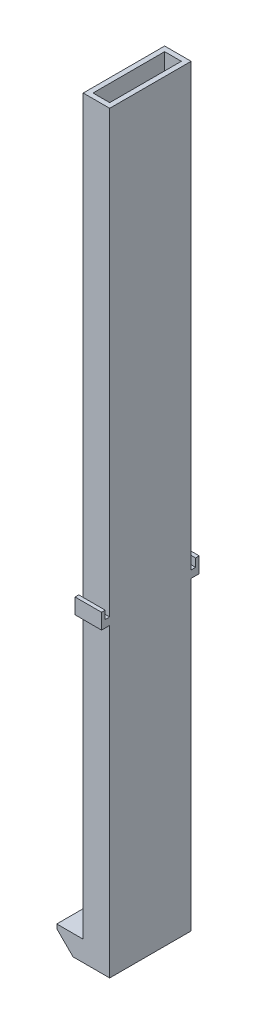
ISO-10303-21;
HEADER;
FILE_DESCRIPTION(('STEP AP214'),'2;1');
FILE_NAME('part.step','',(''),(''),'','','');
FILE_SCHEMA(('AUTOMOTIVE_DESIGN { 1 0 10303 214 1 1 1 1 }'));
ENDSEC;
DATA;
#1=APPLICATION_CONTEXT('core data for automotive mechanical design processes');
#2=APPLICATION_PROTOCOL_DEFINITION('international standard','automotive_design',2000,#1);
#3=PRODUCT_CONTEXT('',#1,'mechanical');
#4=PRODUCT('Part','Part','',(#3));
#5=PRODUCT_RELATED_PRODUCT_CATEGORY('part','',(#4));
#6=PRODUCT_DEFINITION_FORMATION('','',#4);
#7=PRODUCT_DEFINITION_CONTEXT('part definition',#1,'design');
#8=PRODUCT_DEFINITION('design','',#6,#7);
#9=PRODUCT_DEFINITION_SHAPE('','',#8);
#10=(LENGTH_UNIT() NAMED_UNIT(*) SI_UNIT(.MILLI.,.METRE.));
#11=(NAMED_UNIT(*) PLANE_ANGLE_UNIT() SI_UNIT($,.RADIAN.));
#12=(NAMED_UNIT(*) SI_UNIT($,.STERADIAN.) SOLID_ANGLE_UNIT());
#13=UNCERTAINTY_MEASURE_WITH_UNIT(LENGTH_MEASURE(1.E-05),#10,'distance_accuracy_value','');
#14=(GEOMETRIC_REPRESENTATION_CONTEXT(3) GLOBAL_UNCERTAINTY_ASSIGNED_CONTEXT((#13)) GLOBAL_UNIT_ASSIGNED_CONTEXT((#10,
#11,#12)) REPRESENTATION_CONTEXT('',''));
#15=CARTESIAN_POINT('',(0.,0.,0.));
#16=DIRECTION('',(0.,0.,1.));
#17=DIRECTION('',(1.,0.,0.));
#18=AXIS2_PLACEMENT_3D('',#15,#16,#17);
#19=CARTESIAN_POINT('',(0.,0.,0.));
#20=DIRECTION('',(0.,0.,-1.));
#21=DIRECTION('',(-1.,0.,0.));
#22=AXIS2_PLACEMENT_3D('',#19,#20,#21);
#23=PLANE('',#22);
#24=DIRECTION('',(0.,1.,0.));
#25=VECTOR('',#24,1.);
#26=CARTESIAN_POINT('',(3.25,-46.25,0.));
#27=LINE('',#26,#25);
#28=CARTESIAN_POINT('',(3.25,-7.85000000000001,0.));
#29=VERTEX_POINT('',#28);
#30=CARTESIAN_POINT('',(3.25,46.25,0.));
#31=VERTEX_POINT('',#30);
#32=EDGE_CURVE('E418',#29,#31,#27,.T.);
#33=ORIENTED_EDGE('',*,*,#32,.F.);
#34=DIRECTION('',(-1.,0.,0.));
#35=VECTOR('',#34,1.);
#36=CARTESIAN_POINT('',(3.25,-7.85000000000001,0.));
#37=LINE('',#36,#35);
#38=CARTESIAN_POINT('',(0.,-7.85,0.));
#39=VERTEX_POINT('',#38);
#40=EDGE_CURVE('E304',#29,#39,#37,.T.);
#41=ORIENTED_EDGE('',*,*,#40,.T.);
#42=DIRECTION('',(0.,1.,0.));
#43=VECTOR('',#42,1.);
#44=CARTESIAN_POINT('',(0.,46.25,0.));
#45=LINE('',#44,#43);
#46=CARTESIAN_POINT('',(0.,46.25,0.));
#47=VERTEX_POINT('',#46);
#48=EDGE_CURVE('E370',#39,#47,#45,.T.);
#49=ORIENTED_EDGE('',*,*,#48,.T.);
#50=DIRECTION('',(1.,0.,0.));
#51=VECTOR('',#50,1.);
#52=CARTESIAN_POINT('',(-3.25,46.25,0.));
#53=LINE('',#52,#51);
#54=EDGE_CURVE('E414',#47,#31,#53,.T.);
#55=ORIENTED_EDGE('',*,*,#54,.T.);
#56=EDGE_LOOP('',(#33,#41,#49,#55));
#57=FACE_BOUND('',#56,.T.);
#58=ADVANCED_FACE('F47',(#57),#23,.T.);
#59=CARTESIAN_POINT('',(0.,0.,10.));
#60=DIRECTION('',(0.,0.,-1.));
#61=DIRECTION('',(-1.,0.,0.));
#62=AXIS2_PLACEMENT_3D('',#59,#60,#61);
#63=PLANE('',#62);
#64=DIRECTION('',(-1.,0.,0.));
#65=VECTOR('',#64,1.);
#66=CARTESIAN_POINT('',(3.25,-7.85000000000001,10.));
#67=LINE('',#66,#65);
#68=CARTESIAN_POINT('',(3.25,-7.85000000000001,10.));
#69=VERTEX_POINT('',#68);
#70=CARTESIAN_POINT('',(0.,-7.85000000000001,10.));
#71=VERTEX_POINT('',#70);
#72=EDGE_CURVE('E351',#69,#71,#67,.T.);
#73=ORIENTED_EDGE('',*,*,#72,.F.);
#74=DIRECTION('',(0.,1.,0.));
#75=VECTOR('',#74,1.);
#76=CARTESIAN_POINT('',(3.25,-46.25,10.));
#77=LINE('',#76,#75);
#78=CARTESIAN_POINT('',(3.25,46.25,10.));
#79=VERTEX_POINT('',#78);
#80=EDGE_CURVE('E403',#69,#79,#77,.T.);
#81=ORIENTED_EDGE('',*,*,#80,.T.);
#82=DIRECTION('',(1.,0.,0.));
#83=VECTOR('',#82,1.);
#84=CARTESIAN_POINT('',(-3.25,46.25,10.));
#85=LINE('',#84,#83);
#86=CARTESIAN_POINT('',(0.,46.25,10.));
#87=VERTEX_POINT('',#86);
#88=EDGE_CURVE('E398',#87,#79,#85,.T.);
#89=ORIENTED_EDGE('',*,*,#88,.F.);
#90=DIRECTION('',(0.,1.,0.));
#91=VECTOR('',#90,1.);
#92=CARTESIAN_POINT('',(0.,46.25,10.));
#93=LINE('',#92,#91);
#94=EDGE_CURVE('E380',#71,#87,#93,.T.);
#95=ORIENTED_EDGE('',*,*,#94,.F.);
#96=EDGE_LOOP('',(#73,#81,#89,#95));
#97=FACE_BOUND('',#96,.T.);
#98=ADVANCED_FACE('F486',(#97),#63,.F.);
#99=CARTESIAN_POINT('',(-3.25,-46.25,10.));
#100=DIRECTION('',(-1.,0.,0.));
#101=DIRECTION('',(0.,0.,1.));
#102=AXIS2_PLACEMENT_3D('',#99,#100,#101);
#103=PLANE('',#102);
#104=DIRECTION('',(0.,1.,0.));
#105=VECTOR('',#104,1.);
#106=CARTESIAN_POINT('',(-3.25,-46.25,0.));
#107=LINE('',#106,#105);
#108=CARTESIAN_POINT('',(-3.25,-44.25,0.));
#109=VERTEX_POINT('',#108);
#110=CARTESIAN_POINT('',(-3.24999999999999,-43.75,0.));
#111=VERTEX_POINT('',#110);
#112=EDGE_CURVE('E388',#109,#111,#107,.T.);
#113=ORIENTED_EDGE('',*,*,#112,.F.);
#114=DIRECTION('',(0.,0.,1.));
#115=VECTOR('',#114,1.);
#116=CARTESIAN_POINT('',(-3.25,-44.25,10.));
#117=LINE('',#116,#115);
#118=CARTESIAN_POINT('',(-3.25,-44.25,10.));
#119=VERTEX_POINT('',#118);
#120=EDGE_CURVE('E57',#109,#119,#117,.T.);
#121=ORIENTED_EDGE('',*,*,#120,.T.);
#122=DIRECTION('',(0.,1.,0.));
#123=VECTOR('',#122,1.);
#124=CARTESIAN_POINT('',(-3.25,-46.25,10.));
#125=LINE('',#124,#123);
#126=CARTESIAN_POINT('',(-3.24999999999999,-43.75,10.));
#127=VERTEX_POINT('',#126);
#128=EDGE_CURVE('E395',#119,#127,#125,.T.);
#129=ORIENTED_EDGE('',*,*,#128,.T.);
#130=DIRECTION('',(0.,0.,1.));
#131=VECTOR('',#130,1.);
#132=CARTESIAN_POINT('',(-3.24999999999999,-43.75,0.));
#133=LINE('',#132,#131);
#134=EDGE_CURVE('E376',#111,#127,#133,.T.);
#135=ORIENTED_EDGE('',*,*,#134,.F.);
#136=EDGE_LOOP('',(#113,#121,#129,#135));
#137=FACE_BOUND('',#136,.T.);
#138=ADVANCED_FACE('F443',(#137),#103,.T.);
#139=CARTESIAN_POINT('',(-3.25,-46.25,10.));
#140=DIRECTION('',(0.,1.,0.));
#141=DIRECTION('',(0.,0.,1.));
#142=AXIS2_PLACEMENT_3D('',#139,#140,#141);
#143=PLANE('',#142);
#144=DIRECTION('',(1.,0.,0.));
#145=VECTOR('',#144,1.);
#146=CARTESIAN_POINT('',(-3.25,-46.25,10.));
#147=LINE('',#146,#145);
#148=CARTESIAN_POINT('',(-1.25,-46.25,10.));
#149=VERTEX_POINT('',#148);
#150=CARTESIAN_POINT('',(3.25,-46.25,10.));
#151=VERTEX_POINT('',#150);
#152=EDGE_CURVE('E408',#149,#151,#147,.T.);
#153=ORIENTED_EDGE('',*,*,#152,.F.);
#154=DIRECTION('',(0.,0.,-1.));
#155=VECTOR('',#154,1.);
#156=CARTESIAN_POINT('',(-1.25,-46.25,0.));
#157=LINE('',#156,#155);
#158=CARTESIAN_POINT('',(-1.25,-46.25,0.));
#159=VERTEX_POINT('',#158);
#160=EDGE_CURVE('E429',#149,#159,#157,.T.);
#161=ORIENTED_EDGE('',*,*,#160,.T.);
#162=DIRECTION('',(1.,0.,0.));
#163=VECTOR('',#162,1.);
#164=CARTESIAN_POINT('',(-3.25,-46.25,0.));
#165=LINE('',#164,#163);
#166=CARTESIAN_POINT('',(3.25,-46.25,0.));
#167=VERTEX_POINT('',#166);
#168=EDGE_CURVE('E399',#159,#167,#165,.T.);
#169=ORIENTED_EDGE('',*,*,#168,.T.);
#170=DIRECTION('',(0.,0.,-1.));
#171=VECTOR('',#170,1.);
#172=CARTESIAN_POINT('',(3.25,-46.25,10.));
#173=LINE('',#172,#171);
#174=EDGE_CURVE('E425',#151,#167,#173,.T.);
#175=ORIENTED_EDGE('',*,*,#174,.F.);
#176=EDGE_LOOP('',(#153,#161,#169,#175));
#177=FACE_BOUND('',#176,.T.);
#178=ADVANCED_FACE('F455',(#177),#143,.F.);
#179=CARTESIAN_POINT('',(3.25,-46.25,10.));
#180=DIRECTION('',(-1.,0.,0.));
#181=DIRECTION('',(0.,0.,1.));
#182=AXIS2_PLACEMENT_3D('',#179,#180,#181);
#183=PLANE('',#182);
#184=CARTESIAN_POINT('',(3.25,-8.75000000000001,0.));
#185=VERTEX_POINT('',#184);
#186=EDGE_CURVE('E419',#167,#185,#27,.T.);
#187=ORIENTED_EDGE('',*,*,#186,.T.);
#188=DIRECTION('',(0.,0.,-1.));
#189=VECTOR('',#188,1.);
#190=CARTESIAN_POINT('',(3.25,-8.75000000000001,0.));
#191=LINE('',#190,#189);
#192=CARTESIAN_POINT('',(3.25,-8.75000000000001,-1.00000000000001));
#193=VERTEX_POINT('',#192);
#194=EDGE_CURVE('E254',#185,#193,#191,.T.);
#195=ORIENTED_EDGE('',*,*,#194,.T.);
#196=DIRECTION('',(0.,1.,0.));
#197=VECTOR('',#196,1.);
#198=CARTESIAN_POINT('',(3.25,-8.75000000000001,-1.00000000000001));
#199=LINE('',#198,#197);
#200=CARTESIAN_POINT('',(3.25,-6.85000000000001,-1.00000000000001));
#201=VERTEX_POINT('',#200);
#202=EDGE_CURVE('E270',#193,#201,#199,.T.);
#203=ORIENTED_EDGE('',*,*,#202,.T.);
#204=DIRECTION('',(0.,0.,1.));
#205=VECTOR('',#204,1.);
#206=CARTESIAN_POINT('',(3.25,-6.85000000000001,-1.00000000000001));
#207=LINE('',#206,#205);
#208=CARTESIAN_POINT('',(3.25,-6.85000000000001,-0.550000000000005));
#209=VERTEX_POINT('',#208);
#210=EDGE_CURVE('E267',#201,#209,#207,.T.);
#211=ORIENTED_EDGE('',*,*,#210,.T.);
#212=DIRECTION('',(0.,1.,0.));
#213=VECTOR('',#212,1.);
#214=CARTESIAN_POINT('',(3.25,-7.85000000000001,-0.550000000000005));
#215=LINE('',#214,#213);
#216=CARTESIAN_POINT('',(3.25,-7.85000000000001,-0.550000000000005));
#217=VERTEX_POINT('',#216);
#218=EDGE_CURVE('E263',#217,#209,#215,.T.);
#219=ORIENTED_EDGE('',*,*,#218,.F.);
#220=DIRECTION('',(0.,0.,-1.));
#221=VECTOR('',#220,1.);
#222=CARTESIAN_POINT('',(3.25,-7.85000000000001,0.));
#223=LINE('',#222,#221);
#224=EDGE_CURVE('E258',#29,#217,#223,.T.);
#225=ORIENTED_EDGE('',*,*,#224,.F.);
#226=ORIENTED_EDGE('',*,*,#32,.T.);
#227=DIRECTION('',(0.,0.,-1.));
#228=VECTOR('',#227,1.);
#229=CARTESIAN_POINT('',(3.25,46.25,10.));
#230=LINE('',#229,#228);
#231=EDGE_CURVE('E411',#79,#31,#230,.T.);
#232=ORIENTED_EDGE('',*,*,#231,.F.);
#233=ORIENTED_EDGE('',*,*,#80,.F.);
#234=DIRECTION('',(0.,0.,1.));
#235=VECTOR('',#234,1.);
#236=CARTESIAN_POINT('',(3.25,-7.85000000000001,10.));
#237=LINE('',#236,#235);
#238=CARTESIAN_POINT('',(3.25,-7.85000000000001,10.55));
#239=VERTEX_POINT('',#238);
#240=EDGE_CURVE('E325',#69,#239,#237,.T.);
#241=ORIENTED_EDGE('',*,*,#240,.T.);
#242=DIRECTION('',(0.,1.,0.));
#243=VECTOR('',#242,1.);
#244=CARTESIAN_POINT('',(3.25,-7.85000000000001,10.55));
#245=LINE('',#244,#243);
#246=CARTESIAN_POINT('',(3.25,-6.85000000000001,10.55));
#247=VERTEX_POINT('',#246);
#248=EDGE_CURVE('E322',#239,#247,#245,.T.);
#249=ORIENTED_EDGE('',*,*,#248,.T.);
#250=DIRECTION('',(0.,0.,-1.));
#251=VECTOR('',#250,1.);
#252=CARTESIAN_POINT('',(3.25,-6.85000000000001,11.));
#253=LINE('',#252,#251);
#254=CARTESIAN_POINT('',(3.25,-6.85000000000001,11.));
#255=VERTEX_POINT('',#254);
#256=EDGE_CURVE('E318',#255,#247,#253,.T.);
#257=ORIENTED_EDGE('',*,*,#256,.F.);
#258=DIRECTION('',(0.,1.,0.));
#259=VECTOR('',#258,1.);
#260=CARTESIAN_POINT('',(3.25,-8.75000000000001,11.));
#261=LINE('',#260,#259);
#262=CARTESIAN_POINT('',(3.25,-8.75000000000001,11.));
#263=VERTEX_POINT('',#262);
#264=EDGE_CURVE('E313',#263,#255,#261,.T.);
#265=ORIENTED_EDGE('',*,*,#264,.F.);
#266=DIRECTION('',(0.,0.,1.));
#267=VECTOR('',#266,1.);
#268=CARTESIAN_POINT('',(3.25,-8.75000000000001,10.));
#269=LINE('',#268,#267);
#270=CARTESIAN_POINT('',(3.25,-8.75000000000001,10.));
#271=VERTEX_POINT('',#270);
#272=EDGE_CURVE('E309',#271,#263,#269,.T.);
#273=ORIENTED_EDGE('',*,*,#272,.F.);
#274=EDGE_CURVE('E404',#151,#271,#77,.T.);
#275=ORIENTED_EDGE('',*,*,#274,.F.);
#276=ORIENTED_EDGE('',*,*,#174,.T.);
#277=EDGE_LOOP('',(#187,#195,#203,#211,#219,#225,#226,#232,#233,#241,#249,#257,#265,#273,#275,#276));
#278=FACE_BOUND('',#277,.T.);
#279=ADVANCED_FACE('F462',(#278),#183,.F.);
#280=CARTESIAN_POINT('',(-3.25,46.25,10.));
#281=DIRECTION('',(0.,1.,0.));
#282=DIRECTION('',(0.,0.,1.));
#283=AXIS2_PLACEMENT_3D('',#280,#281,#282);
#284=PLANE('',#283);
#285=DIRECTION('',(0.,0.,-1.));
#286=VECTOR('',#285,1.);
#287=CARTESIAN_POINT('',(2.65,46.25,9.4));
#288=LINE('',#287,#286);
#289=CARTESIAN_POINT('',(2.65,46.25,9.4));
#290=VERTEX_POINT('',#289);
#291=CARTESIAN_POINT('',(2.65,46.25,0.6));
#292=VERTEX_POINT('',#291);
#293=EDGE_CURVE('E64',#290,#292,#288,.T.);
#294=ORIENTED_EDGE('',*,*,#293,.F.);
#295=DIRECTION('',(1.,0.,0.));
#296=VECTOR('',#295,1.);
#297=CARTESIAN_POINT('',(0.6,46.25,9.4));
#298=LINE('',#297,#296);
#299=CARTESIAN_POINT('',(0.6,46.25,9.4));
#300=VERTEX_POINT('',#299);
#301=EDGE_CURVE('E226',#300,#290,#298,.T.);
#302=ORIENTED_EDGE('',*,*,#301,.F.);
#303=DIRECTION('',(0.,0.,1.));
#304=VECTOR('',#303,1.);
#305=CARTESIAN_POINT('',(0.6,46.25,9.4));
#306=LINE('',#305,#304);
#307=CARTESIAN_POINT('',(0.6,46.25,0.6));
#308=VERTEX_POINT('',#307);
#309=EDGE_CURVE('E230',#308,#300,#306,.T.);
#310=ORIENTED_EDGE('',*,*,#309,.F.);
#311=DIRECTION('',(-1.,0.,0.));
#312=VECTOR('',#311,1.);
#313=CARTESIAN_POINT('',(0.6,46.25,0.6));
#314=LINE('',#313,#312);
#315=EDGE_CURVE('E239',#292,#308,#314,.T.);
#316=ORIENTED_EDGE('',*,*,#315,.F.);
#317=EDGE_LOOP('',(#294,#302,#310,#316));
#318=FACE_BOUND('',#317,.T.);
#319=DIRECTION('',(0.,0.,1.));
#320=VECTOR('',#319,1.);
#321=CARTESIAN_POINT('',(0.,46.25,0.));
#322=LINE('',#321,#320);
#323=EDGE_CURVE('E384',#47,#87,#322,.T.);
#324=ORIENTED_EDGE('',*,*,#323,.T.);
#325=ORIENTED_EDGE('',*,*,#88,.T.);
#326=ORIENTED_EDGE('',*,*,#231,.T.);
#327=ORIENTED_EDGE('',*,*,#54,.F.);
#328=EDGE_LOOP('',(#324,#325,#326,#327));
#329=FACE_BOUND('',#328,.T.);
#330=ADVANCED_FACE('F501',(#318,#329),#284,.T.);
#331=ORIENTED_EDGE('',*,*,#274,.T.);
#332=DIRECTION('',(-1.,0.,0.));
#333=VECTOR('',#332,1.);
#334=CARTESIAN_POINT('',(3.25,-8.75000000000001,10.));
#335=LINE('',#334,#333);
#336=CARTESIAN_POINT('',(0.,-8.74999999999999,10.));
#337=VERTEX_POINT('',#336);
#338=EDGE_CURVE('E346',#271,#337,#335,.T.);
#339=ORIENTED_EDGE('',*,*,#338,.T.);
#340=CARTESIAN_POINT('',(0.,-43.75,10.));
#341=VERTEX_POINT('',#340);
#342=EDGE_CURVE('E371',#341,#337,#93,.T.);
#343=ORIENTED_EDGE('',*,*,#342,.F.);
#344=DIRECTION('',(1.,0.,0.));
#345=VECTOR('',#344,1.);
#346=CARTESIAN_POINT('',(-3.24999999999999,-43.75,10.));
#347=LINE('',#346,#345);
#348=EDGE_CURVE('E350',#127,#341,#347,.T.);
#349=ORIENTED_EDGE('',*,*,#348,.F.);
#350=ORIENTED_EDGE('',*,*,#128,.F.);
#351=DIRECTION('',(0.707106781186548,-0.707106781186548,0.));
#352=VECTOR('',#351,1.);
#353=CARTESIAN_POINT('',(-1.25,-46.25,10.));
#354=LINE('',#353,#352);
#355=EDGE_CURVE('E11',#119,#149,#354,.T.);
#356=ORIENTED_EDGE('',*,*,#355,.T.);
#357=ORIENTED_EDGE('',*,*,#152,.T.);
#358=EDGE_LOOP('',(#331,#339,#343,#349,#350,#356,#357));
#359=FACE_BOUND('',#358,.T.);
#360=ADVANCED_FACE('F449',(#359),#63,.F.);
#361=DIRECTION('',(-1.,0.,0.));
#362=VECTOR('',#361,1.);
#363=CARTESIAN_POINT('',(3.25,-8.75000000000001,0.));
#364=LINE('',#363,#362);
#365=CARTESIAN_POINT('',(0.,-8.75000000000001,0.));
#366=VERTEX_POINT('',#365);
#367=EDGE_CURVE('E273',#185,#366,#364,.T.);
#368=ORIENTED_EDGE('',*,*,#367,.F.);
#369=ORIENTED_EDGE('',*,*,#186,.F.);
#370=ORIENTED_EDGE('',*,*,#168,.F.);
#371=DIRECTION('',(-0.707106781186548,0.707106781186548,0.));
#372=VECTOR('',#371,1.);
#373=CARTESIAN_POINT('',(-23.75,-23.75,0.));
#374=LINE('',#373,#372);
#375=EDGE_CURVE('E436',#159,#109,#374,.T.);
#376=ORIENTED_EDGE('',*,*,#375,.T.);
#377=ORIENTED_EDGE('',*,*,#112,.T.);
#378=DIRECTION('',(1.,0.,0.));
#379=VECTOR('',#378,1.);
#380=CARTESIAN_POINT('',(-3.24999999999999,-43.75,0.));
#381=LINE('',#380,#379);
#382=CARTESIAN_POINT('',(0.,-43.75,0.));
#383=VERTEX_POINT('',#382);
#384=EDGE_CURVE('E366',#111,#383,#381,.T.);
#385=ORIENTED_EDGE('',*,*,#384,.T.);
#386=EDGE_CURVE('E372',#383,#366,#45,.T.);
#387=ORIENTED_EDGE('',*,*,#386,.T.);
#388=EDGE_LOOP('',(#368,#369,#370,#376,#377,#385,#387));
#389=FACE_BOUND('',#388,.T.);
#390=ADVANCED_FACE('F460',(#389),#23,.T.);
#391=CARTESIAN_POINT('',(0.,46.25,0.));
#392=DIRECTION('',(1.,0.,0.));
#393=DIRECTION('',(0.,1.,0.));
#394=AXIS2_PLACEMENT_3D('',#391,#392,#393);
#395=PLANE('',#394);
#396=ORIENTED_EDGE('',*,*,#342,.T.);
#397=DIRECTION('',(0.,0.,1.));
#398=VECTOR('',#397,1.);
#399=CARTESIAN_POINT('',(0.,-8.75000000000001,10.));
#400=LINE('',#399,#398);
#401=CARTESIAN_POINT('',(0.,-8.75000000000001,11.));
#402=VERTEX_POINT('',#401);
#403=EDGE_CURVE('E293',#337,#402,#400,.T.);
#404=ORIENTED_EDGE('',*,*,#403,.T.);
#405=DIRECTION('',(0.,1.,0.));
#406=VECTOR('',#405,1.);
#407=CARTESIAN_POINT('',(0.,-8.75000000000001,11.));
#408=LINE('',#407,#406);
#409=CARTESIAN_POINT('',(0.,-6.85000000000001,11.));
#410=VERTEX_POINT('',#409);
#411=EDGE_CURVE('E332',#402,#410,#408,.T.);
#412=ORIENTED_EDGE('',*,*,#411,.T.);
#413=DIRECTION('',(0.,0.,-1.));
#414=VECTOR('',#413,1.);
#415=CARTESIAN_POINT('',(0.,-6.85000000000001,11.));
#416=LINE('',#415,#414);
#417=CARTESIAN_POINT('',(0.,-6.85000000000001,10.55));
#418=VERTEX_POINT('',#417);
#419=EDGE_CURVE('E336',#410,#418,#416,.T.);
#420=ORIENTED_EDGE('',*,*,#419,.T.);
#421=DIRECTION('',(0.,1.,0.));
#422=VECTOR('',#421,1.);
#423=CARTESIAN_POINT('',(0.,-7.85000000000001,10.55));
#424=LINE('',#423,#422);
#425=CARTESIAN_POINT('',(0.,-7.85000000000001,10.55));
#426=VERTEX_POINT('',#425);
#427=EDGE_CURVE('E340',#426,#418,#424,.T.);
#428=ORIENTED_EDGE('',*,*,#427,.F.);
#429=DIRECTION('',(0.,0.,1.));
#430=VECTOR('',#429,1.);
#431=CARTESIAN_POINT('',(0.,-7.85000000000001,10.));
#432=LINE('',#431,#430);
#433=EDGE_CURVE('E314',#71,#426,#432,.T.);
#434=ORIENTED_EDGE('',*,*,#433,.F.);
#435=ORIENTED_EDGE('',*,*,#94,.T.);
#436=ORIENTED_EDGE('',*,*,#323,.F.);
#437=ORIENTED_EDGE('',*,*,#48,.F.);
#438=DIRECTION('',(0.,0.,-1.));
#439=VECTOR('',#438,1.);
#440=CARTESIAN_POINT('',(0.,-7.85000000000001,0.));
#441=LINE('',#440,#439);
#442=CARTESIAN_POINT('',(0.,-7.85000000000001,-0.550000000000005));
#443=VERTEX_POINT('',#442);
#444=EDGE_CURVE('E72',#39,#443,#441,.T.);
#445=ORIENTED_EDGE('',*,*,#444,.T.);
#446=DIRECTION('',(0.,1.,0.));
#447=VECTOR('',#446,1.);
#448=CARTESIAN_POINT('',(0.,-7.85000000000001,-0.550000000000005));
#449=LINE('',#448,#447);
#450=CARTESIAN_POINT('',(0.,-6.85000000000001,-0.550000000000005));
#451=VERTEX_POINT('',#450);
#452=EDGE_CURVE('E279',#443,#451,#449,.T.);
#453=ORIENTED_EDGE('',*,*,#452,.T.);
#454=DIRECTION('',(0.,0.,1.));
#455=VECTOR('',#454,1.);
#456=CARTESIAN_POINT('',(0.,-6.85000000000001,-1.00000000000001));
#457=LINE('',#456,#455);
#458=CARTESIAN_POINT('',(0.,-6.85000000000001,-1.00000000000001));
#459=VERTEX_POINT('',#458);
#460=EDGE_CURVE('E283',#459,#451,#457,.T.);
#461=ORIENTED_EDGE('',*,*,#460,.F.);
#462=DIRECTION('',(0.,1.,0.));
#463=VECTOR('',#462,1.);
#464=CARTESIAN_POINT('',(0.,-8.75000000000001,-1.00000000000001));
#465=LINE('',#464,#463);
#466=CARTESIAN_POINT('',(0.,-8.75000000000001,-1.00000000000001));
#467=VERTEX_POINT('',#466);
#468=EDGE_CURVE('E259',#467,#459,#465,.T.);
#469=ORIENTED_EDGE('',*,*,#468,.F.);
#470=DIRECTION('',(0.,0.,-1.));
#471=VECTOR('',#470,1.);
#472=CARTESIAN_POINT('',(0.,-8.75000000000001,0.));
#473=LINE('',#472,#471);
#474=EDGE_CURVE('E248',#366,#467,#473,.T.);
#475=ORIENTED_EDGE('',*,*,#474,.F.);
#476=ORIENTED_EDGE('',*,*,#386,.F.);
#477=DIRECTION('',(0.,0.,1.));
#478=VECTOR('',#477,1.);
#479=CARTESIAN_POINT('',(0.,-43.75,0.));
#480=LINE('',#479,#478);
#481=EDGE_CURVE('E389',#383,#341,#480,.T.);
#482=ORIENTED_EDGE('',*,*,#481,.T.);
#483=EDGE_LOOP('',(#396,#404,#412,#420,#428,#434,#435,#436,#437,#445,#453,#461,#469,#475,#476,#482));
#484=FACE_BOUND('',#483,.T.);
#485=ADVANCED_FACE('F469',(#484),#395,.F.);
#486=CARTESIAN_POINT('',(-3.24999999999999,-43.75,0.));
#487=DIRECTION('',(0.,-1.,0.));
#488=DIRECTION('',(0.,0.,-1.));
#489=AXIS2_PLACEMENT_3D('',#486,#487,#488);
#490=PLANE('',#489);
#491=ORIENTED_EDGE('',*,*,#348,.T.);
#492=ORIENTED_EDGE('',*,*,#481,.F.);
#493=ORIENTED_EDGE('',*,*,#384,.F.);
#494=ORIENTED_EDGE('',*,*,#134,.T.);
#495=EDGE_LOOP('',(#491,#492,#493,#494));
#496=FACE_BOUND('',#495,.T.);
#497=ADVANCED_FACE('F474',(#496),#490,.F.);
#498=CARTESIAN_POINT('',(-1.25,-46.25,10.));
#499=DIRECTION('',(-0.707106781186547,-0.707106781186547,0.));
#500=DIRECTION('',(0.,0.,1.));
#501=AXIS2_PLACEMENT_3D('',#498,#499,#500);
#502=PLANE('',#501);
#503=ORIENTED_EDGE('',*,*,#355,.F.);
#504=ORIENTED_EDGE('',*,*,#120,.F.);
#505=ORIENTED_EDGE('',*,*,#375,.F.);
#506=ORIENTED_EDGE('',*,*,#160,.F.);
#507=EDGE_LOOP('',(#503,#504,#505,#506));
#508=FACE_BOUND('',#507,.T.);
#509=ADVANCED_FACE('F50',(#508),#502,.T.);
#510=CARTESIAN_POINT('',(3.25,-8.75000000000001,10.));
#511=DIRECTION('',(0.,-1.,0.));
#512=DIRECTION('',(0.,0.,-1.));
#513=AXIS2_PLACEMENT_3D('',#510,#511,#512);
#514=PLANE('',#513);
#515=ORIENTED_EDGE('',*,*,#403,.F.);
#516=ORIENTED_EDGE('',*,*,#338,.F.);
#517=ORIENTED_EDGE('',*,*,#272,.T.);
#518=DIRECTION('',(-1.,0.,0.));
#519=VECTOR('',#518,1.);
#520=CARTESIAN_POINT('',(3.25,-8.75000000000001,11.));
#521=LINE('',#520,#519);
#522=EDGE_CURVE('E328',#263,#402,#521,.T.);
#523=ORIENTED_EDGE('',*,*,#522,.T.);
#524=EDGE_LOOP('',(#515,#516,#517,#523));
#525=FACE_BOUND('',#524,.T.);
#526=ADVANCED_FACE('F481',(#525),#514,.T.);
#527=CARTESIAN_POINT('',(3.25,-7.85000000000001,10.));
#528=DIRECTION('',(0.,-1.,0.));
#529=DIRECTION('',(0.,0.,-1.));
#530=AXIS2_PLACEMENT_3D('',#527,#528,#529);
#531=PLANE('',#530);
#532=ORIENTED_EDGE('',*,*,#433,.T.);
#533=DIRECTION('',(-1.,0.,0.));
#534=VECTOR('',#533,1.);
#535=CARTESIAN_POINT('',(3.25,-7.85000000000001,10.55));
#536=LINE('',#535,#534);
#537=EDGE_CURVE('E354',#239,#426,#536,.T.);
#538=ORIENTED_EDGE('',*,*,#537,.F.);
#539=ORIENTED_EDGE('',*,*,#240,.F.);
#540=ORIENTED_EDGE('',*,*,#72,.T.);
#541=EDGE_LOOP('',(#532,#538,#539,#540));
#542=FACE_BOUND('',#541,.T.);
#543=ADVANCED_FACE('F560',(#542),#531,.F.);
#544=CARTESIAN_POINT('',(3.25,-7.85000000000001,10.55));
#545=DIRECTION('',(0.,0.,1.));
#546=DIRECTION('',(1.,0.,0.));
#547=AXIS2_PLACEMENT_3D('',#544,#545,#546);
#548=PLANE('',#547);
#549=ORIENTED_EDGE('',*,*,#427,.T.);
#550=DIRECTION('',(-1.,0.,0.));
#551=VECTOR('',#550,1.);
#552=CARTESIAN_POINT('',(3.25,-6.85000000000001,10.55));
#553=LINE('',#552,#551);
#554=EDGE_CURVE('E358',#247,#418,#553,.T.);
#555=ORIENTED_EDGE('',*,*,#554,.F.);
#556=ORIENTED_EDGE('',*,*,#248,.F.);
#557=ORIENTED_EDGE('',*,*,#537,.T.);
#558=EDGE_LOOP('',(#549,#555,#556,#557));
#559=FACE_BOUND('',#558,.T.);
#560=ADVANCED_FACE('F569',(#559),#548,.F.);
#561=CARTESIAN_POINT('',(3.25,-6.85000000000001,11.));
#562=DIRECTION('',(0.,1.,0.));
#563=DIRECTION('',(0.,0.,1.));
#564=AXIS2_PLACEMENT_3D('',#561,#562,#563);
#565=PLANE('',#564);
#566=ORIENTED_EDGE('',*,*,#419,.F.);
#567=DIRECTION('',(-1.,0.,0.));
#568=VECTOR('',#567,1.);
#569=CARTESIAN_POINT('',(3.25,-6.85000000000001,11.));
#570=LINE('',#569,#568);
#571=EDGE_CURVE('E361',#255,#410,#570,.T.);
#572=ORIENTED_EDGE('',*,*,#571,.F.);
#573=ORIENTED_EDGE('',*,*,#256,.T.);
#574=ORIENTED_EDGE('',*,*,#554,.T.);
#575=EDGE_LOOP('',(#566,#572,#573,#574));
#576=FACE_BOUND('',#575,.T.);
#577=ADVANCED_FACE('F579',(#576),#565,.T.);
#578=CARTESIAN_POINT('',(3.25,-8.75000000000001,11.));
#579=DIRECTION('',(0.,0.,1.));
#580=DIRECTION('',(1.,0.,0.));
#581=AXIS2_PLACEMENT_3D('',#578,#579,#580);
#582=PLANE('',#581);
#583=ORIENTED_EDGE('',*,*,#411,.F.);
#584=ORIENTED_EDGE('',*,*,#522,.F.);
#585=ORIENTED_EDGE('',*,*,#264,.T.);
#586=ORIENTED_EDGE('',*,*,#571,.T.);
#587=EDGE_LOOP('',(#583,#584,#585,#586));
#588=FACE_BOUND('',#587,.T.);
#589=ADVANCED_FACE('F589',(#588),#582,.T.);
#590=CARTESIAN_POINT('',(3.25,-8.75000000000001,0.));
#591=DIRECTION('',(0.,1.,0.));
#592=DIRECTION('',(0.,0.,1.));
#593=AXIS2_PLACEMENT_3D('',#590,#591,#592);
#594=PLANE('',#593);
#595=ORIENTED_EDGE('',*,*,#474,.T.);
#596=DIRECTION('',(-1.,0.,0.));
#597=VECTOR('',#596,1.);
#598=CARTESIAN_POINT('',(3.25,-8.75000000000001,-1.00000000000001));
#599=LINE('',#598,#597);
#600=EDGE_CURVE('E289',#193,#467,#599,.T.);
#601=ORIENTED_EDGE('',*,*,#600,.F.);
#602=ORIENTED_EDGE('',*,*,#194,.F.);
#603=ORIENTED_EDGE('',*,*,#367,.T.);
#604=EDGE_LOOP('',(#595,#601,#602,#603));
#605=FACE_BOUND('',#604,.T.);
#606=ADVANCED_FACE('F597',(#605),#594,.F.);
#607=CARTESIAN_POINT('',(3.25,-8.75000000000001,-1.00000000000001));
#608=DIRECTION('',(0.,0.,1.));
#609=DIRECTION('',(1.,0.,0.));
#610=AXIS2_PLACEMENT_3D('',#607,#608,#609);
#611=PLANE('',#610);
#612=ORIENTED_EDGE('',*,*,#468,.T.);
#613=DIRECTION('',(-1.,0.,0.));
#614=VECTOR('',#613,1.);
#615=CARTESIAN_POINT('',(3.25,-6.85000000000001,-1.00000000000001));
#616=LINE('',#615,#614);
#617=EDGE_CURVE('E294',#201,#459,#616,.T.);
#618=ORIENTED_EDGE('',*,*,#617,.F.);
#619=ORIENTED_EDGE('',*,*,#202,.F.);
#620=ORIENTED_EDGE('',*,*,#600,.T.);
#621=EDGE_LOOP('',(#612,#618,#619,#620));
#622=FACE_BOUND('',#621,.T.);
#623=ADVANCED_FACE('F609',(#622),#611,.F.);
#624=CARTESIAN_POINT('',(3.25,-6.85000000000001,-1.00000000000001));
#625=DIRECTION('',(0.,-1.,0.));
#626=DIRECTION('',(0.,0.,-1.));
#627=AXIS2_PLACEMENT_3D('',#624,#625,#626);
#628=PLANE('',#627);
#629=ORIENTED_EDGE('',*,*,#460,.T.);
#630=DIRECTION('',(-1.,0.,0.));
#631=VECTOR('',#630,1.);
#632=CARTESIAN_POINT('',(3.25,-6.85000000000001,-0.550000000000005));
#633=LINE('',#632,#631);
#634=EDGE_CURVE('E298',#209,#451,#633,.T.);
#635=ORIENTED_EDGE('',*,*,#634,.F.);
#636=ORIENTED_EDGE('',*,*,#210,.F.);
#637=ORIENTED_EDGE('',*,*,#617,.T.);
#638=EDGE_LOOP('',(#629,#635,#636,#637));
#639=FACE_BOUND('',#638,.T.);
#640=ADVANCED_FACE('F618',(#639),#628,.F.);
#641=CARTESIAN_POINT('',(3.25,-7.85000000000001,-0.550000000000005));
#642=DIRECTION('',(0.,0.,1.));
#643=DIRECTION('',(1.,0.,0.));
#644=AXIS2_PLACEMENT_3D('',#641,#642,#643);
#645=PLANE('',#644);
#646=ORIENTED_EDGE('',*,*,#452,.F.);
#647=DIRECTION('',(-1.,0.,0.));
#648=VECTOR('',#647,1.);
#649=CARTESIAN_POINT('',(3.25,-7.85000000000001,-0.550000000000005));
#650=LINE('',#649,#648);
#651=EDGE_CURVE('E301',#217,#443,#650,.T.);
#652=ORIENTED_EDGE('',*,*,#651,.F.);
#653=ORIENTED_EDGE('',*,*,#218,.T.);
#654=ORIENTED_EDGE('',*,*,#634,.T.);
#655=EDGE_LOOP('',(#646,#652,#653,#654));
#656=FACE_BOUND('',#655,.T.);
#657=ADVANCED_FACE('F627',(#656),#645,.T.);
#658=CARTESIAN_POINT('',(3.25,-7.85000000000001,0.));
#659=DIRECTION('',(0.,1.,0.));
#660=DIRECTION('',(0.,0.,1.));
#661=AXIS2_PLACEMENT_3D('',#658,#659,#660);
#662=PLANE('',#661);
#663=ORIENTED_EDGE('',*,*,#444,.F.);
#664=ORIENTED_EDGE('',*,*,#40,.F.);
#665=ORIENTED_EDGE('',*,*,#224,.T.);
#666=ORIENTED_EDGE('',*,*,#651,.T.);
#667=EDGE_LOOP('',(#663,#664,#665,#666));
#668=FACE_BOUND('',#667,.T.);
#669=ADVANCED_FACE('F636',(#668),#662,.T.);
#670=CARTESIAN_POINT('',(2.65,-33.75,9.4));
#671=DIRECTION('',(1.,0.,0.));
#672=DIRECTION('',(0.,0.,-1.));
#673=AXIS2_PLACEMENT_3D('',#670,#671,#672);
#674=PLANE('',#673);
#675=ORIENTED_EDGE('',*,*,#293,.T.);
#676=DIRECTION('',(0.,1.,0.));
#677=VECTOR('',#676,1.);
#678=CARTESIAN_POINT('',(2.65,-33.75,0.6));
#679=LINE('',#678,#677);
#680=CARTESIAN_POINT('',(2.65,-33.75,0.6));
#681=VERTEX_POINT('',#680);
#682=EDGE_CURVE('E201',#681,#292,#679,.T.);
#683=ORIENTED_EDGE('',*,*,#682,.F.);
#684=DIRECTION('',(0.,0.,-1.));
#685=VECTOR('',#684,1.);
#686=CARTESIAN_POINT('',(2.65,-33.75,9.4));
#687=LINE('',#686,#685);
#688=CARTESIAN_POINT('',(2.65,-33.75,9.4));
#689=VERTEX_POINT('',#688);
#690=EDGE_CURVE('E205',#689,#681,#687,.T.);
#691=ORIENTED_EDGE('',*,*,#690,.F.);
#692=DIRECTION('',(0.,1.,0.));
#693=VECTOR('',#692,1.);
#694=CARTESIAN_POINT('',(2.65,-33.75,9.4));
#695=LINE('',#694,#693);
#696=EDGE_CURVE('E245',#689,#290,#695,.T.);
#697=ORIENTED_EDGE('',*,*,#696,.T.);
#698=EDGE_LOOP('',(#675,#683,#691,#697));
#699=FACE_BOUND('',#698,.T.);
#700=ADVANCED_FACE('F203',(#699),#674,.F.);
#701=CARTESIAN_POINT('',(0.6,-33.75,9.4));
#702=DIRECTION('',(0.,0.,1.));
#703=DIRECTION('',(1.,0.,0.));
#704=AXIS2_PLACEMENT_3D('',#701,#702,#703);
#705=PLANE('',#704);
#706=ORIENTED_EDGE('',*,*,#301,.T.);
#707=ORIENTED_EDGE('',*,*,#696,.F.);
#708=DIRECTION('',(1.,0.,0.));
#709=VECTOR('',#708,1.);
#710=CARTESIAN_POINT('',(0.6,-33.75,9.4));
#711=LINE('',#710,#709);
#712=CARTESIAN_POINT('',(0.6,-33.75,9.4));
#713=VERTEX_POINT('',#712);
#714=EDGE_CURVE('E212',#713,#689,#711,.T.);
#715=ORIENTED_EDGE('',*,*,#714,.F.);
#716=DIRECTION('',(0.,1.,0.));
#717=VECTOR('',#716,1.);
#718=CARTESIAN_POINT('',(0.6,-33.75,9.4));
#719=LINE('',#718,#717);
#720=EDGE_CURVE('E249',#713,#300,#719,.T.);
#721=ORIENTED_EDGE('',*,*,#720,.T.);
#722=EDGE_LOOP('',(#706,#707,#715,#721));
#723=FACE_BOUND('',#722,.T.);
#724=ADVANCED_FACE('F650',(#723),#705,.F.);
#725=CARTESIAN_POINT('',(0.6,-33.75,9.4));
#726=DIRECTION('',(-1.,0.,0.));
#727=DIRECTION('',(0.,0.,1.));
#728=AXIS2_PLACEMENT_3D('',#725,#726,#727);
#729=PLANE('',#728);
#730=ORIENTED_EDGE('',*,*,#309,.T.);
#731=ORIENTED_EDGE('',*,*,#720,.F.);
#732=DIRECTION('',(0.,0.,1.));
#733=VECTOR('',#732,1.);
#734=CARTESIAN_POINT('',(0.6,-33.75,9.4));
#735=LINE('',#734,#733);
#736=CARTESIAN_POINT('',(0.6,-33.75,0.6));
#737=VERTEX_POINT('',#736);
#738=EDGE_CURVE('E221',#737,#713,#735,.T.);
#739=ORIENTED_EDGE('',*,*,#738,.F.);
#740=DIRECTION('',(0.,1.,0.));
#741=VECTOR('',#740,1.);
#742=CARTESIAN_POINT('',(0.6,-33.75,0.6));
#743=LINE('',#742,#741);
#744=EDGE_CURVE('E211',#737,#308,#743,.T.);
#745=ORIENTED_EDGE('',*,*,#744,.T.);
#746=EDGE_LOOP('',(#730,#731,#739,#745));
#747=FACE_BOUND('',#746,.T.);
#748=ADVANCED_FACE('F658',(#747),#729,.F.);
#749=CARTESIAN_POINT('',(0.6,-33.75,0.6));
#750=DIRECTION('',(0.,0.,-1.));
#751=DIRECTION('',(-1.,0.,0.));
#752=AXIS2_PLACEMENT_3D('',#749,#750,#751);
#753=PLANE('',#752);
#754=ORIENTED_EDGE('',*,*,#315,.T.);
#755=ORIENTED_EDGE('',*,*,#744,.F.);
#756=DIRECTION('',(-1.,0.,0.));
#757=VECTOR('',#756,1.);
#758=CARTESIAN_POINT('',(0.6,-33.75,0.6));
#759=LINE('',#758,#757);
#760=EDGE_CURVE('E215',#681,#737,#759,.T.);
#761=ORIENTED_EDGE('',*,*,#760,.F.);
#762=ORIENTED_EDGE('',*,*,#682,.T.);
#763=EDGE_LOOP('',(#754,#755,#761,#762));
#764=FACE_BOUND('',#763,.T.);
#765=ADVANCED_FACE('F216',(#764),#753,.F.);
#766=CARTESIAN_POINT('',(0.,-33.75,0.));
#767=DIRECTION('',(0.,-1.,0.));
#768=DIRECTION('',(0.,0.,-1.));
#769=AXIS2_PLACEMENT_3D('',#766,#767,#768);
#770=PLANE('',#769);
#771=ORIENTED_EDGE('',*,*,#690,.T.);
#772=ORIENTED_EDGE('',*,*,#760,.T.);
#773=ORIENTED_EDGE('',*,*,#738,.T.);
#774=ORIENTED_EDGE('',*,*,#714,.T.);
#775=EDGE_LOOP('',(#771,#772,#773,#774));
#776=FACE_BOUND('',#775,.T.);
#777=ADVANCED_FACE('F223',(#776),#770,.F.);
#778=CLOSED_SHELL('',(#58,#98,#138,#178,#279,#330,#360,#390,#485,#497,#509,#526,#543,#560,#577,
#589,#606,#623,#640,#657,#669,#700,#724,#748,#765,#777));
#779=MANIFOLD_SOLID_BREP('B2',#778);
#780=ADVANCED_BREP_SHAPE_REPRESENTATION('',(#18,#779),#14);
#781=SHAPE_DEFINITION_REPRESENTATION(#9,#780);
ENDSEC;
END-ISO-10303-21;
